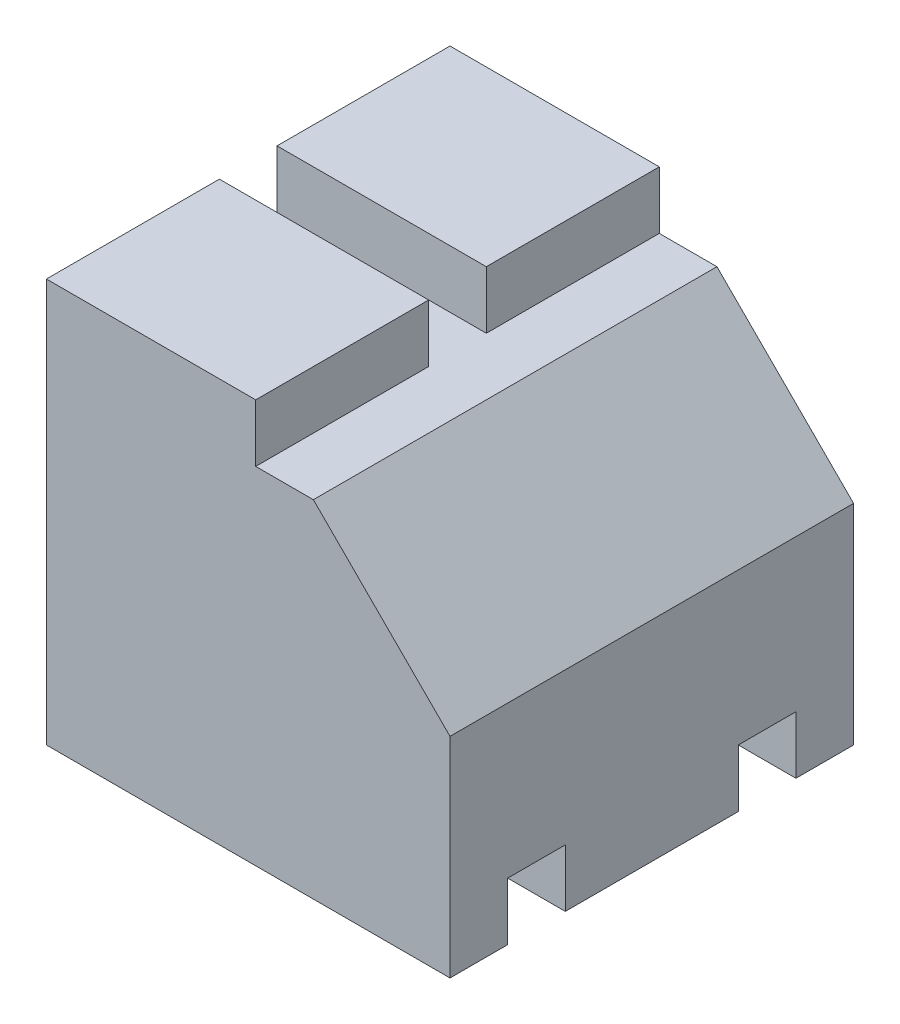
ISO-10303-21;
HEADER;
FILE_DESCRIPTION(('STEP AP214'),'2;1');
FILE_NAME('part.step','',(''),(''),'','','');
FILE_SCHEMA(('AUTOMOTIVE_DESIGN { 1 0 10303 214 1 1 1 1 }'));
ENDSEC;
DATA;
#1=APPLICATION_CONTEXT('core data for automotive mechanical design processes');
#2=APPLICATION_PROTOCOL_DEFINITION('international standard','automotive_design',2000,#1);
#3=PRODUCT_CONTEXT('',#1,'mechanical');
#4=PRODUCT('Part','Part','',(#3));
#5=PRODUCT_RELATED_PRODUCT_CATEGORY('part','',(#4));
#6=PRODUCT_DEFINITION_FORMATION('','',#4);
#7=PRODUCT_DEFINITION_CONTEXT('part definition',#1,'design');
#8=PRODUCT_DEFINITION('design','',#6,#7);
#9=PRODUCT_DEFINITION_SHAPE('','',#8);
#10=(LENGTH_UNIT() NAMED_UNIT(*) SI_UNIT(.MILLI.,.METRE.));
#11=(NAMED_UNIT(*) PLANE_ANGLE_UNIT() SI_UNIT($,.RADIAN.));
#12=(NAMED_UNIT(*) SI_UNIT($,.STERADIAN.) SOLID_ANGLE_UNIT());
#13=UNCERTAINTY_MEASURE_WITH_UNIT(LENGTH_MEASURE(1.E-05),#10,'distance_accuracy_value','');
#14=(GEOMETRIC_REPRESENTATION_CONTEXT(3) GLOBAL_UNCERTAINTY_ASSIGNED_CONTEXT((#13)) GLOBAL_UNIT_ASSIGNED_CONTEXT((#10,
#11,#12)) REPRESENTATION_CONTEXT('',''));
#15=CARTESIAN_POINT('',(0.,0.,0.));
#16=DIRECTION('',(0.,0.,1.));
#17=DIRECTION('',(1.,0.,0.));
#18=AXIS2_PLACEMENT_3D('',#15,#16,#17);
#19=CARTESIAN_POINT('',(70.,70.,0.));
#20=DIRECTION('',(0.,-1.,0.));
#21=DIRECTION('',(0.,0.,-1.));
#22=AXIS2_PLACEMENT_3D('',#19,#20,#21);
#23=PLANE('',#22);
#24=DIRECTION('',(0.,0.,-1.));
#25=VECTOR('',#24,1.);
#26=CARTESIAN_POINT('',(36.2999798950812,70.,309.054445662277));
#27=LINE('',#26,#25);
#28=CARTESIAN_POINT('',(36.2999798950813,70.,70.));
#29=VERTEX_POINT('',#28);
#30=CARTESIAN_POINT('',(36.2999798950816,70.,40.));
#31=VERTEX_POINT('',#30);
#32=EDGE_CURVE('E314',#29,#31,#27,.T.);
#33=ORIENTED_EDGE('',*,*,#32,.T.);
#34=DIRECTION('',(1.,0.,0.));
#35=VECTOR('',#34,1.);
#36=CARTESIAN_POINT('',(0.,70.,40.));
#37=LINE('',#36,#35);
#38=CARTESIAN_POINT('',(0.,70.,40.));
#39=VERTEX_POINT('',#38);
#40=EDGE_CURVE('E208',#39,#31,#37,.T.);
#41=ORIENTED_EDGE('',*,*,#40,.F.);
#42=DIRECTION('',(0.,0.,1.));
#43=VECTOR('',#42,1.);
#44=CARTESIAN_POINT('',(0.,70.,0.));
#45=LINE('',#44,#43);
#46=CARTESIAN_POINT('',(0.,70.,70.));
#47=VERTEX_POINT('',#46);
#48=EDGE_CURVE('E196',#39,#47,#45,.T.);
#49=ORIENTED_EDGE('',*,*,#48,.T.);
#50=DIRECTION('',(-1.,0.,0.));
#51=VECTOR('',#50,1.);
#52=CARTESIAN_POINT('',(70.,70.,70.));
#53=LINE('',#52,#51);
#54=EDGE_CURVE('E355',#29,#47,#53,.T.);
#55=ORIENTED_EDGE('',*,*,#54,.F.);
#56=EDGE_LOOP('',(#33,#41,#49,#55));
#57=FACE_BOUND('',#56,.T.);
#58=ADVANCED_FACE('F40',(#57),#23,.F.);
#59=CARTESIAN_POINT('',(36.2999798950816,70.,284.054445662277));
#60=DIRECTION('',(1.,0.,0.));
#61=DIRECTION('',(0.,0.,-1.));
#62=AXIS2_PLACEMENT_3D('',#59,#60,#61);
#63=PLANE('',#62);
#64=DIRECTION('',(0.,-1.,0.));
#65=VECTOR('',#64,1.);
#66=CARTESIAN_POINT('',(36.2999798950816,70.,40.));
#67=LINE('',#66,#65);
#68=CARTESIAN_POINT('',(36.2999798950816,60.,40.));
#69=VERTEX_POINT('',#68);
#70=EDGE_CURVE('E56',#31,#69,#67,.T.);
#71=ORIENTED_EDGE('',*,*,#70,.F.);
#72=ORIENTED_EDGE('',*,*,#32,.F.);
#73=DIRECTION('',(0.,-1.,0.));
#74=VECTOR('',#73,1.);
#75=CARTESIAN_POINT('',(36.2999798950816,0.,70.));
#76=LINE('',#75,#74);
#77=CARTESIAN_POINT('',(36.2999798950816,60.,70.));
#78=VERTEX_POINT('',#77);
#79=EDGE_CURVE('E11',#29,#78,#76,.T.);
#80=ORIENTED_EDGE('',*,*,#79,.T.);
#81=DIRECTION('',(0.,0.,-1.));
#82=VECTOR('',#81,1.);
#83=CARTESIAN_POINT('',(36.2999798950816,60.,284.054445662277));
#84=LINE('',#83,#82);
#85=EDGE_CURVE('E221',#78,#69,#84,.T.);
#86=ORIENTED_EDGE('',*,*,#85,.T.);
#87=EDGE_LOOP('',(#71,#72,#80,#86));
#88=FACE_BOUND('',#87,.T.);
#89=ADVANCED_FACE('F372',(#88),#63,.T.);
#90=CARTESIAN_POINT('',(70.,0.,0.));
#91=DIRECTION('',(0.,0.,1.));
#92=DIRECTION('',(1.,0.,0.));
#93=AXIS2_PLACEMENT_3D('',#90,#91,#92);
#94=PLANE('',#93);
#95=DIRECTION('',(0.,1.,0.));
#96=VECTOR('',#95,1.);
#97=CARTESIAN_POINT('',(36.2999798950816,0.,0.));
#98=LINE('',#97,#96);
#99=CARTESIAN_POINT('',(36.2999798950816,60.,0.));
#100=VERTEX_POINT('',#99);
#101=CARTESIAN_POINT('',(36.2999798950812,70.,0.));
#102=VERTEX_POINT('',#101);
#103=EDGE_CURVE('E227',#100,#102,#98,.T.);
#104=ORIENTED_EDGE('',*,*,#103,.F.);
#105=DIRECTION('',(-1.,0.,0.));
#106=VECTOR('',#105,1.);
#107=CARTESIAN_POINT('',(70.,60.,0.));
#108=LINE('',#107,#106);
#109=CARTESIAN_POINT('',(46.2999798950814,60.,0.));
#110=VERTEX_POINT('',#109);
#111=EDGE_CURVE('E220',#110,#100,#108,.T.);
#112=ORIENTED_EDGE('',*,*,#111,.F.);
#113=DIRECTION('',(-0.707106781186552,0.707106781186544,0.));
#114=VECTOR('',#113,1.);
#115=CARTESIAN_POINT('',(36.2999798950812,70.,0.));
#116=LINE('',#115,#114);
#117=CARTESIAN_POINT('',(70.,36.2999798950816,0.));
#118=VERTEX_POINT('',#117);
#119=EDGE_CURVE('E303',#118,#110,#116,.T.);
#120=ORIENTED_EDGE('',*,*,#119,.F.);
#121=DIRECTION('',(0.,1.,0.));
#122=VECTOR('',#121,1.);
#123=CARTESIAN_POINT('',(70.,0.,0.));
#124=LINE('',#123,#122);
#125=CARTESIAN_POINT('',(70.,0.,0.));
#126=VERTEX_POINT('',#125);
#127=EDGE_CURVE('E319',#126,#118,#124,.T.);
#128=ORIENTED_EDGE('',*,*,#127,.F.);
#129=DIRECTION('',(-1.,0.,0.));
#130=VECTOR('',#129,1.);
#131=CARTESIAN_POINT('',(70.,0.,0.));
#132=LINE('',#131,#130);
#133=CARTESIAN_POINT('',(0.,0.,0.));
#134=VERTEX_POINT('',#133);
#135=EDGE_CURVE('E331',#126,#134,#132,.T.);
#136=ORIENTED_EDGE('',*,*,#135,.T.);
#137=DIRECTION('',(0.,1.,0.));
#138=VECTOR('',#137,1.);
#139=CARTESIAN_POINT('',(0.,0.,0.));
#140=LINE('',#139,#138);
#141=CARTESIAN_POINT('',(0.,70.,0.));
#142=VERTEX_POINT('',#141);
#143=EDGE_CURVE('E318',#134,#142,#140,.T.);
#144=ORIENTED_EDGE('',*,*,#143,.T.);
#145=DIRECTION('',(-1.,0.,0.));
#146=VECTOR('',#145,1.);
#147=CARTESIAN_POINT('',(70.,70.,0.));
#148=LINE('',#147,#146);
#149=EDGE_CURVE('E359',#102,#142,#148,.T.);
#150=ORIENTED_EDGE('',*,*,#149,.F.);
#151=EDGE_LOOP('',(#104,#112,#120,#128,#136,#144,#150));
#152=FACE_BOUND('',#151,.T.);
#153=ADVANCED_FACE('F42',(#152),#94,.F.);
#154=CARTESIAN_POINT('',(70.,0.,70.));
#155=DIRECTION('',(0.,0.,-1.));
#156=DIRECTION('',(-1.,0.,0.));
#157=AXIS2_PLACEMENT_3D('',#154,#155,#156);
#158=PLANE('',#157);
#159=ORIENTED_EDGE('',*,*,#79,.F.);
#160=ORIENTED_EDGE('',*,*,#54,.T.);
#161=DIRECTION('',(0.,-1.,0.));
#162=VECTOR('',#161,1.);
#163=CARTESIAN_POINT('',(0.,0.,70.));
#164=LINE('',#163,#162);
#165=CARTESIAN_POINT('',(0.,0.,70.));
#166=VERTEX_POINT('',#165);
#167=EDGE_CURVE('E340',#47,#166,#164,.T.);
#168=ORIENTED_EDGE('',*,*,#167,.T.);
#169=DIRECTION('',(-1.,0.,0.));
#170=VECTOR('',#169,1.);
#171=CARTESIAN_POINT('',(70.,0.,70.));
#172=LINE('',#171,#170);
#173=CARTESIAN_POINT('',(70.,0.,70.));
#174=VERTEX_POINT('',#173);
#175=EDGE_CURVE('E351',#174,#166,#172,.T.);
#176=ORIENTED_EDGE('',*,*,#175,.F.);
#177=DIRECTION('',(0.,-1.,0.));
#178=VECTOR('',#177,1.);
#179=CARTESIAN_POINT('',(70.,0.,70.));
#180=LINE('',#179,#178);
#181=CARTESIAN_POINT('',(70.,36.2999798950816,70.));
#182=VERTEX_POINT('',#181);
#183=EDGE_CURVE('E322',#182,#174,#180,.T.);
#184=ORIENTED_EDGE('',*,*,#183,.F.);
#185=DIRECTION('',(-0.707106781186552,0.707106781186544,0.));
#186=VECTOR('',#185,1.);
#187=CARTESIAN_POINT('',(36.2999798950812,70.,70.));
#188=LINE('',#187,#186);
#189=CARTESIAN_POINT('',(46.2999798950816,60.,70.));
#190=VERTEX_POINT('',#189);
#191=EDGE_CURVE('E259',#182,#190,#188,.T.);
#192=ORIENTED_EDGE('',*,*,#191,.T.);
#193=DIRECTION('',(1.,0.,0.));
#194=VECTOR('',#193,1.);
#195=CARTESIAN_POINT('',(70.,60.,70.));
#196=LINE('',#195,#194);
#197=EDGE_CURVE('E49',#78,#190,#196,.T.);
#198=ORIENTED_EDGE('',*,*,#197,.F.);
#199=EDGE_LOOP('',(#159,#160,#168,#176,#184,#192,#198));
#200=FACE_BOUND('',#199,.T.);
#201=ADVANCED_FACE('F366',(#200),#158,.F.);
#202=CARTESIAN_POINT('',(70.,0.,0.));
#203=DIRECTION('',(0.,1.,0.));
#204=DIRECTION('',(0.,0.,1.));
#205=AXIS2_PLACEMENT_3D('',#202,#203,#204);
#206=PLANE('',#205);
#207=DIRECTION('',(0.,0.,-1.));
#208=VECTOR('',#207,1.);
#209=CARTESIAN_POINT('',(0.,0.,0.));
#210=LINE('',#209,#208);
#211=CARTESIAN_POINT('',(0.,0.,50.));
#212=VERTEX_POINT('',#211);
#213=CARTESIAN_POINT('',(0.,0.,20.));
#214=VERTEX_POINT('',#213);
#215=EDGE_CURVE('E347',#212,#214,#210,.T.);
#216=ORIENTED_EDGE('',*,*,#215,.T.);
#217=DIRECTION('',(1.,0.,0.));
#218=VECTOR('',#217,1.);
#219=CARTESIAN_POINT('',(0.,0.,20.));
#220=LINE('',#219,#218);
#221=CARTESIAN_POINT('',(70.,0.,20.));
#222=VERTEX_POINT('',#221);
#223=EDGE_CURVE('E244',#214,#222,#220,.T.);
#224=ORIENTED_EDGE('',*,*,#223,.T.);
#225=DIRECTION('',(0.,0.,-1.));
#226=VECTOR('',#225,1.);
#227=CARTESIAN_POINT('',(70.,0.,0.));
#228=LINE('',#227,#226);
#229=CARTESIAN_POINT('',(70.,0.,50.));
#230=VERTEX_POINT('',#229);
#231=EDGE_CURVE('E332',#230,#222,#228,.T.);
#232=ORIENTED_EDGE('',*,*,#231,.F.);
#233=DIRECTION('',(1.,0.,0.));
#234=VECTOR('',#233,1.);
#235=CARTESIAN_POINT('',(0.,0.,50.));
#236=LINE('',#235,#234);
#237=EDGE_CURVE('E249',#212,#230,#236,.T.);
#238=ORIENTED_EDGE('',*,*,#237,.F.);
#239=EDGE_LOOP('',(#216,#224,#232,#238));
#240=FACE_BOUND('',#239,.T.);
#241=ADVANCED_FACE('F455',(#240),#206,.F.);
#242=CARTESIAN_POINT('',(70.,0.,10.));
#243=VERTEX_POINT('',#242);
#244=EDGE_CURVE('E326',#243,#126,#228,.T.);
#245=ORIENTED_EDGE('',*,*,#244,.F.);
#246=DIRECTION('',(1.,0.,0.));
#247=VECTOR('',#246,1.);
#248=CARTESIAN_POINT('',(0.,0.,10.));
#249=LINE('',#248,#247);
#250=CARTESIAN_POINT('',(0.,0.,10.));
#251=VERTEX_POINT('',#250);
#252=EDGE_CURVE('E263',#251,#243,#249,.T.);
#253=ORIENTED_EDGE('',*,*,#252,.F.);
#254=EDGE_CURVE('E343',#251,#134,#210,.T.);
#255=ORIENTED_EDGE('',*,*,#254,.T.);
#256=ORIENTED_EDGE('',*,*,#135,.F.);
#257=EDGE_LOOP('',(#245,#253,#255,#256));
#258=FACE_BOUND('',#257,.T.);
#259=ADVANCED_FACE('F471',(#258),#206,.F.);
#260=CARTESIAN_POINT('',(0.,70.,30.));
#261=VERTEX_POINT('',#260);
#262=EDGE_CURVE('E336',#142,#261,#45,.T.);
#263=ORIENTED_EDGE('',*,*,#262,.T.);
#264=DIRECTION('',(1.,0.,0.));
#265=VECTOR('',#264,1.);
#266=CARTESIAN_POINT('',(0.,70.,30.));
#267=LINE('',#266,#265);
#268=CARTESIAN_POINT('',(36.2999798950816,70.,30.));
#269=VERTEX_POINT('',#268);
#270=EDGE_CURVE('E211',#261,#269,#267,.T.);
#271=ORIENTED_EDGE('',*,*,#270,.T.);
#272=EDGE_CURVE('E313',#269,#102,#27,.T.);
#273=ORIENTED_EDGE('',*,*,#272,.T.);
#274=ORIENTED_EDGE('',*,*,#149,.T.);
#275=EDGE_LOOP('',(#263,#271,#273,#274));
#276=FACE_BOUND('',#275,.T.);
#277=ADVANCED_FACE('F475',(#276),#23,.F.);
#278=CARTESIAN_POINT('',(0.,0.,60.));
#279=VERTEX_POINT('',#278);
#280=EDGE_CURVE('E323',#166,#279,#210,.T.);
#281=ORIENTED_EDGE('',*,*,#280,.T.);
#282=DIRECTION('',(1.,0.,0.));
#283=VECTOR('',#282,1.);
#284=CARTESIAN_POINT('',(0.,0.,60.));
#285=LINE('',#284,#283);
#286=CARTESIAN_POINT('',(70.,0.,60.));
#287=VERTEX_POINT('',#286);
#288=EDGE_CURVE('E294',#279,#287,#285,.T.);
#289=ORIENTED_EDGE('',*,*,#288,.T.);
#290=EDGE_CURVE('E327',#174,#287,#228,.T.);
#291=ORIENTED_EDGE('',*,*,#290,.F.);
#292=ORIENTED_EDGE('',*,*,#175,.T.);
#293=EDGE_LOOP('',(#281,#289,#291,#292));
#294=FACE_BOUND('',#293,.T.);
#295=ADVANCED_FACE('F377',(#294),#206,.F.);
#296=CARTESIAN_POINT('',(70.,0.,0.));
#297=DIRECTION('',(1.,0.,0.));
#298=DIRECTION('',(0.,0.,-1.));
#299=AXIS2_PLACEMENT_3D('',#296,#297,#298);
#300=PLANE('',#299);
#301=DIRECTION('',(0.,-1.,0.));
#302=VECTOR('',#301,1.);
#303=CARTESIAN_POINT('',(70.,0.,20.));
#304=LINE('',#303,#302);
#305=CARTESIAN_POINT('',(70.,9.99999999999999,20.));
#306=VERTEX_POINT('',#305);
#307=EDGE_CURVE('E245',#306,#222,#304,.T.);
#308=ORIENTED_EDGE('',*,*,#307,.F.);
#309=DIRECTION('',(0.,0.,1.));
#310=VECTOR('',#309,1.);
#311=CARTESIAN_POINT('',(70.,9.99999999999999,20.));
#312=LINE('',#311,#310);
#313=CARTESIAN_POINT('',(70.,9.99999999999999,10.));
#314=VERTEX_POINT('',#313);
#315=EDGE_CURVE('E236',#314,#306,#312,.T.);
#316=ORIENTED_EDGE('',*,*,#315,.F.);
#317=DIRECTION('',(0.,1.,0.));
#318=VECTOR('',#317,1.);
#319=CARTESIAN_POINT('',(70.,0.,10.));
#320=LINE('',#319,#318);
#321=EDGE_CURVE('E248',#243,#314,#320,.T.);
#322=ORIENTED_EDGE('',*,*,#321,.F.);
#323=ORIENTED_EDGE('',*,*,#244,.T.);
#324=ORIENTED_EDGE('',*,*,#127,.T.);
#325=DIRECTION('',(0.,0.,-1.));
#326=VECTOR('',#325,1.);
#327=CARTESIAN_POINT('',(70.,36.2999798950816,309.054445662277));
#328=LINE('',#327,#326);
#329=EDGE_CURVE('E307',#182,#118,#328,.T.);
#330=ORIENTED_EDGE('',*,*,#329,.F.);
#331=ORIENTED_EDGE('',*,*,#183,.T.);
#332=ORIENTED_EDGE('',*,*,#290,.T.);
#333=DIRECTION('',(0.,-1.,0.));
#334=VECTOR('',#333,1.);
#335=CARTESIAN_POINT('',(70.,0.,60.));
#336=LINE('',#335,#334);
#337=CARTESIAN_POINT('',(70.,9.99999999999999,60.));
#338=VERTEX_POINT('',#337);
#339=EDGE_CURVE('E274',#338,#287,#336,.T.);
#340=ORIENTED_EDGE('',*,*,#339,.F.);
#341=DIRECTION('',(0.,0.,1.));
#342=VECTOR('',#341,1.);
#343=CARTESIAN_POINT('',(70.,9.99999999999999,50.));
#344=LINE('',#343,#342);
#345=CARTESIAN_POINT('',(70.,9.99999999999999,50.));
#346=VERTEX_POINT('',#345);
#347=EDGE_CURVE('E286',#346,#338,#344,.T.);
#348=ORIENTED_EDGE('',*,*,#347,.F.);
#349=DIRECTION('',(0.,1.,0.));
#350=VECTOR('',#349,1.);
#351=CARTESIAN_POINT('',(70.,0.,50.));
#352=LINE('',#351,#350);
#353=EDGE_CURVE('E230',#230,#346,#352,.T.);
#354=ORIENTED_EDGE('',*,*,#353,.F.);
#355=ORIENTED_EDGE('',*,*,#231,.T.);
#356=EDGE_LOOP('',(#308,#316,#322,#323,#324,#330,#331,#332,#340,#348,#354,#355));
#357=FACE_BOUND('',#356,.T.);
#358=ADVANCED_FACE('F450',(#357),#300,.T.);
#359=CARTESIAN_POINT('',(0.,0.,0.));
#360=DIRECTION('',(1.,0.,0.));
#361=DIRECTION('',(0.,0.,-1.));
#362=AXIS2_PLACEMENT_3D('',#359,#360,#361);
#363=PLANE('',#362);
#364=ORIENTED_EDGE('',*,*,#48,.F.);
#365=DIRECTION('',(0.,-1.,0.));
#366=VECTOR('',#365,1.);
#367=CARTESIAN_POINT('',(0.,70.,40.));
#368=LINE('',#367,#366);
#369=CARTESIAN_POINT('',(0.,60.,40.));
#370=VERTEX_POINT('',#369);
#371=EDGE_CURVE('E175',#39,#370,#368,.T.);
#372=ORIENTED_EDGE('',*,*,#371,.T.);
#373=DIRECTION('',(0.,0.,-1.));
#374=VECTOR('',#373,1.);
#375=CARTESIAN_POINT('',(0.,60.,40.));
#376=LINE('',#375,#374);
#377=CARTESIAN_POINT('',(0.,60.,30.));
#378=VERTEX_POINT('',#377);
#379=EDGE_CURVE('E185',#370,#378,#376,.T.);
#380=ORIENTED_EDGE('',*,*,#379,.T.);
#381=DIRECTION('',(0.,1.,0.));
#382=VECTOR('',#381,1.);
#383=CARTESIAN_POINT('',(0.,70.,30.));
#384=LINE('',#383,#382);
#385=EDGE_CURVE('E182',#378,#261,#384,.T.);
#386=ORIENTED_EDGE('',*,*,#385,.T.);
#387=ORIENTED_EDGE('',*,*,#262,.F.);
#388=ORIENTED_EDGE('',*,*,#143,.F.);
#389=ORIENTED_EDGE('',*,*,#254,.F.);
#390=DIRECTION('',(0.,1.,0.));
#391=VECTOR('',#390,1.);
#392=CARTESIAN_POINT('',(0.,0.,10.));
#393=LINE('',#392,#391);
#394=CARTESIAN_POINT('',(0.,9.99999999999999,10.));
#395=VERTEX_POINT('',#394);
#396=EDGE_CURVE('E235',#251,#395,#393,.T.);
#397=ORIENTED_EDGE('',*,*,#396,.T.);
#398=DIRECTION('',(0.,0.,1.));
#399=VECTOR('',#398,1.);
#400=CARTESIAN_POINT('',(0.,9.99999999999999,20.));
#401=LINE('',#400,#399);
#402=CARTESIAN_POINT('',(0.,9.99999999999999,20.));
#403=VERTEX_POINT('',#402);
#404=EDGE_CURVE('E240',#395,#403,#401,.T.);
#405=ORIENTED_EDGE('',*,*,#404,.T.);
#406=DIRECTION('',(0.,-1.,0.));
#407=VECTOR('',#406,1.);
#408=CARTESIAN_POINT('',(0.,0.,20.));
#409=LINE('',#408,#407);
#410=EDGE_CURVE('E231',#403,#214,#409,.T.);
#411=ORIENTED_EDGE('',*,*,#410,.T.);
#412=ORIENTED_EDGE('',*,*,#215,.F.);
#413=DIRECTION('',(0.,1.,0.));
#414=VECTOR('',#413,1.);
#415=CARTESIAN_POINT('',(0.,0.,50.));
#416=LINE('',#415,#414);
#417=CARTESIAN_POINT('',(0.,9.99999999999999,50.));
#418=VERTEX_POINT('',#417);
#419=EDGE_CURVE('E269',#212,#418,#416,.T.);
#420=ORIENTED_EDGE('',*,*,#419,.T.);
#421=DIRECTION('',(0.,0.,1.));
#422=VECTOR('',#421,1.);
#423=CARTESIAN_POINT('',(0.,9.99999999999999,50.));
#424=LINE('',#423,#422);
#425=CARTESIAN_POINT('',(0.,9.99999999999999,60.));
#426=VERTEX_POINT('',#425);
#427=EDGE_CURVE('E273',#418,#426,#424,.T.);
#428=ORIENTED_EDGE('',*,*,#427,.T.);
#429=DIRECTION('',(0.,-1.,0.));
#430=VECTOR('',#429,1.);
#431=CARTESIAN_POINT('',(0.,0.,60.));
#432=LINE('',#431,#430);
#433=EDGE_CURVE('E278',#426,#279,#432,.T.);
#434=ORIENTED_EDGE('',*,*,#433,.T.);
#435=ORIENTED_EDGE('',*,*,#280,.F.);
#436=ORIENTED_EDGE('',*,*,#167,.F.);
#437=EDGE_LOOP('',(#364,#372,#380,#386,#387,#388,#389,#397,#405,#411,#412,#420,#428,#434,#435,#436));
#438=FACE_BOUND('',#437,.T.);
#439=ADVANCED_FACE('F194',(#438),#363,.F.);
#440=CARTESIAN_POINT('',(36.2999798950812,70.,309.054445662277));
#441=DIRECTION('',(0.707106781186543,0.707106781186551,0.));
#442=DIRECTION('',(-0.707106781186552,0.707106781186544,0.));
#443=AXIS2_PLACEMENT_3D('',#440,#441,#442);
#444=PLANE('',#443);
#445=DIRECTION('',(0.,0.,-1.));
#446=VECTOR('',#445,1.);
#447=CARTESIAN_POINT('',(46.2999798950816,60.,284.054445662277));
#448=LINE('',#447,#446);
#449=EDGE_CURVE('E217',#190,#110,#448,.T.);
#450=ORIENTED_EDGE('',*,*,#449,.F.);
#451=ORIENTED_EDGE('',*,*,#191,.F.);
#452=ORIENTED_EDGE('',*,*,#329,.T.);
#453=ORIENTED_EDGE('',*,*,#119,.T.);
#454=EDGE_LOOP('',(#450,#451,#452,#453));
#455=FACE_BOUND('',#454,.T.);
#456=ADVANCED_FACE('F381',(#455),#444,.T.);
#457=CARTESIAN_POINT('',(0.,0.,50.));
#458=DIRECTION('',(0.,0.,-1.));
#459=DIRECTION('',(-1.,0.,0.));
#460=AXIS2_PLACEMENT_3D('',#457,#458,#459);
#461=PLANE('',#460);
#462=ORIENTED_EDGE('',*,*,#353,.T.);
#463=DIRECTION('',(1.,0.,0.));
#464=VECTOR('',#463,1.);
#465=CARTESIAN_POINT('',(0.,9.99999999999999,50.));
#466=LINE('',#465,#464);
#467=EDGE_CURVE('E282',#418,#346,#466,.T.);
#468=ORIENTED_EDGE('',*,*,#467,.F.);
#469=ORIENTED_EDGE('',*,*,#419,.F.);
#470=ORIENTED_EDGE('',*,*,#237,.T.);
#471=EDGE_LOOP('',(#462,#468,#469,#470));
#472=FACE_BOUND('',#471,.T.);
#473=ADVANCED_FACE('F531',(#472),#461,.F.);
#474=CARTESIAN_POINT('',(0.,0.,60.));
#475=DIRECTION('',(0.,0.,1.));
#476=DIRECTION('',(1.,0.,0.));
#477=AXIS2_PLACEMENT_3D('',#474,#475,#476);
#478=PLANE('',#477);
#479=ORIENTED_EDGE('',*,*,#339,.T.);
#480=ORIENTED_EDGE('',*,*,#288,.F.);
#481=ORIENTED_EDGE('',*,*,#433,.F.);
#482=DIRECTION('',(1.,0.,0.));
#483=VECTOR('',#482,1.);
#484=CARTESIAN_POINT('',(0.,9.99999999999999,60.));
#485=LINE('',#484,#483);
#486=EDGE_CURVE('E298',#426,#338,#485,.T.);
#487=ORIENTED_EDGE('',*,*,#486,.T.);
#488=EDGE_LOOP('',(#479,#480,#481,#487));
#489=FACE_BOUND('',#488,.T.);
#490=ADVANCED_FACE('F586',(#489),#478,.F.);
#491=CARTESIAN_POINT('',(0.,9.99999999999999,50.));
#492=DIRECTION('',(0.,1.,0.));
#493=DIRECTION('',(0.,0.,1.));
#494=AXIS2_PLACEMENT_3D('',#491,#492,#493);
#495=PLANE('',#494);
#496=ORIENTED_EDGE('',*,*,#347,.T.);
#497=ORIENTED_EDGE('',*,*,#486,.F.);
#498=ORIENTED_EDGE('',*,*,#427,.F.);
#499=ORIENTED_EDGE('',*,*,#467,.T.);
#500=EDGE_LOOP('',(#496,#497,#498,#499));
#501=FACE_BOUND('',#500,.T.);
#502=ADVANCED_FACE('F576',(#501),#495,.F.);
#503=CARTESIAN_POINT('',(0.,0.,20.));
#504=DIRECTION('',(0.,0.,1.));
#505=DIRECTION('',(1.,0.,0.));
#506=AXIS2_PLACEMENT_3D('',#503,#504,#505);
#507=PLANE('',#506);
#508=ORIENTED_EDGE('',*,*,#307,.T.);
#509=ORIENTED_EDGE('',*,*,#223,.F.);
#510=ORIENTED_EDGE('',*,*,#410,.F.);
#511=DIRECTION('',(1.,0.,0.));
#512=VECTOR('',#511,1.);
#513=CARTESIAN_POINT('',(0.,9.99999999999999,20.));
#514=LINE('',#513,#512);
#515=EDGE_CURVE('E256',#403,#306,#514,.T.);
#516=ORIENTED_EDGE('',*,*,#515,.T.);
#517=EDGE_LOOP('',(#508,#509,#510,#516));
#518=FACE_BOUND('',#517,.T.);
#519=ADVANCED_FACE('F459',(#518),#507,.F.);
#520=CARTESIAN_POINT('',(0.,9.99999999999999,20.));
#521=DIRECTION('',(0.,1.,0.));
#522=DIRECTION('',(0.,0.,1.));
#523=AXIS2_PLACEMENT_3D('',#520,#521,#522);
#524=PLANE('',#523);
#525=ORIENTED_EDGE('',*,*,#315,.T.);
#526=ORIENTED_EDGE('',*,*,#515,.F.);
#527=ORIENTED_EDGE('',*,*,#404,.F.);
#528=DIRECTION('',(1.,0.,0.));
#529=VECTOR('',#528,1.);
#530=CARTESIAN_POINT('',(0.,9.99999999999999,10.));
#531=LINE('',#530,#529);
#532=EDGE_CURVE('E260',#395,#314,#531,.T.);
#533=ORIENTED_EDGE('',*,*,#532,.T.);
#534=EDGE_LOOP('',(#525,#526,#527,#533));
#535=FACE_BOUND('',#534,.T.);
#536=ADVANCED_FACE('F463',(#535),#524,.F.);
#537=CARTESIAN_POINT('',(0.,0.,10.));
#538=DIRECTION('',(0.,0.,-1.));
#539=DIRECTION('',(-1.,0.,0.));
#540=AXIS2_PLACEMENT_3D('',#537,#538,#539);
#541=PLANE('',#540);
#542=ORIENTED_EDGE('',*,*,#321,.T.);
#543=ORIENTED_EDGE('',*,*,#532,.F.);
#544=ORIENTED_EDGE('',*,*,#396,.F.);
#545=ORIENTED_EDGE('',*,*,#252,.T.);
#546=EDGE_LOOP('',(#542,#543,#544,#545));
#547=FACE_BOUND('',#546,.T.);
#548=ADVANCED_FACE('F465',(#547),#541,.F.);
#549=DIRECTION('',(0.,1.,0.));
#550=VECTOR('',#549,1.);
#551=CARTESIAN_POINT('',(36.2999798950816,70.,30.));
#552=LINE('',#551,#550);
#553=CARTESIAN_POINT('',(36.2999798950816,60.,30.));
#554=VERTEX_POINT('',#553);
#555=EDGE_CURVE('E198',#554,#269,#552,.T.);
#556=ORIENTED_EDGE('',*,*,#555,.F.);
#557=EDGE_CURVE('E64',#554,#100,#84,.T.);
#558=ORIENTED_EDGE('',*,*,#557,.T.);
#559=ORIENTED_EDGE('',*,*,#103,.T.);
#560=ORIENTED_EDGE('',*,*,#272,.F.);
#561=EDGE_LOOP('',(#556,#558,#559,#560));
#562=FACE_BOUND('',#561,.T.);
#563=ADVANCED_FACE('F477',(#562),#63,.T.);
#564=CARTESIAN_POINT('',(36.2999798950816,60.,284.054445662277));
#565=DIRECTION('',(0.,1.,0.));
#566=DIRECTION('',(-1.,0.,0.));
#567=AXIS2_PLACEMENT_3D('',#564,#565,#566);
#568=PLANE('',#567);
#569=ORIENTED_EDGE('',*,*,#449,.T.);
#570=ORIENTED_EDGE('',*,*,#111,.T.);
#571=ORIENTED_EDGE('',*,*,#557,.F.);
#572=DIRECTION('',(1.,0.,0.));
#573=VECTOR('',#572,1.);
#574=CARTESIAN_POINT('',(0.,60.,30.));
#575=LINE('',#574,#573);
#576=EDGE_CURVE('E181',#378,#554,#575,.T.);
#577=ORIENTED_EDGE('',*,*,#576,.F.);
#578=ORIENTED_EDGE('',*,*,#379,.F.);
#579=DIRECTION('',(1.,0.,0.));
#580=VECTOR('',#579,1.);
#581=CARTESIAN_POINT('',(0.,60.,40.));
#582=LINE('',#581,#580);
#583=EDGE_CURVE('E171',#370,#69,#582,.T.);
#584=ORIENTED_EDGE('',*,*,#583,.T.);
#585=ORIENTED_EDGE('',*,*,#85,.F.);
#586=ORIENTED_EDGE('',*,*,#197,.T.);
#587=EDGE_LOOP('',(#569,#570,#571,#577,#578,#584,#585,#586));
#588=FACE_BOUND('',#587,.T.);
#589=ADVANCED_FACE('F187',(#588),#568,.T.);
#590=CARTESIAN_POINT('',(0.,70.,40.));
#591=DIRECTION('',(0.,0.,1.));
#592=DIRECTION('',(1.,0.,0.));
#593=AXIS2_PLACEMENT_3D('',#590,#591,#592);
#594=PLANE('',#593);
#595=ORIENTED_EDGE('',*,*,#70,.T.);
#596=ORIENTED_EDGE('',*,*,#583,.F.);
#597=ORIENTED_EDGE('',*,*,#371,.F.);
#598=ORIENTED_EDGE('',*,*,#40,.T.);
#599=EDGE_LOOP('',(#595,#596,#597,#598));
#600=FACE_BOUND('',#599,.T.);
#601=ADVANCED_FACE('F173',(#600),#594,.F.);
#602=CARTESIAN_POINT('',(0.,70.,30.));
#603=DIRECTION('',(0.,0.,-1.));
#604=DIRECTION('',(-1.,0.,0.));
#605=AXIS2_PLACEMENT_3D('',#602,#603,#604);
#606=PLANE('',#605);
#607=ORIENTED_EDGE('',*,*,#555,.T.);
#608=ORIENTED_EDGE('',*,*,#270,.F.);
#609=ORIENTED_EDGE('',*,*,#385,.F.);
#610=ORIENTED_EDGE('',*,*,#576,.T.);
#611=EDGE_LOOP('',(#607,#608,#609,#610));
#612=FACE_BOUND('',#611,.T.);
#613=ADVANCED_FACE('F479',(#612),#606,.F.);
#614=CLOSED_SHELL('',(#58,#89,#153,#201,#241,#259,#277,#295,#358,#439,#456,#473,#490,#502,#519,
#536,#548,#563,#589,#601,#613));
#615=MANIFOLD_SOLID_BREP('B2',#614);
#616=ADVANCED_BREP_SHAPE_REPRESENTATION('',(#18,#615),#14);
#617=SHAPE_DEFINITION_REPRESENTATION(#9,#616);
ENDSEC;
END-ISO-10303-21;
